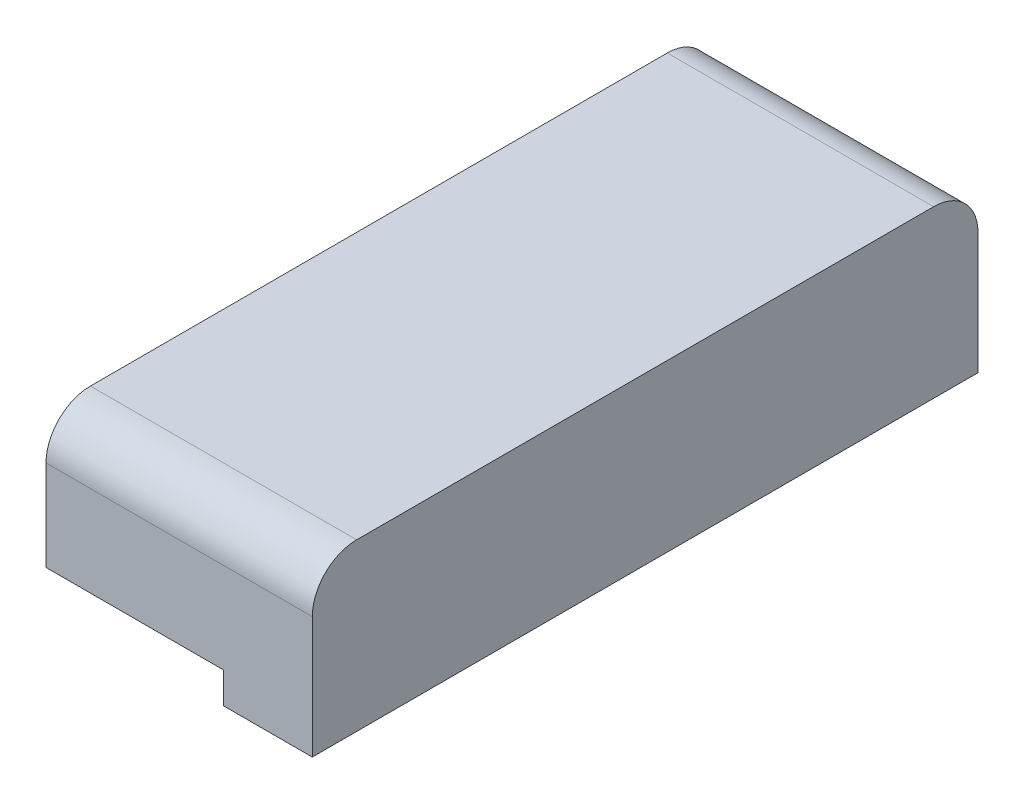
ISO-10303-21;
HEADER;
FILE_DESCRIPTION(('STEP AP214'),'2;1');
FILE_NAME('part.step','',(''),(''),'','','');
FILE_SCHEMA(('AUTOMOTIVE_DESIGN { 1 0 10303 214 1 1 1 1 }'));
ENDSEC;
DATA;
#1=APPLICATION_CONTEXT('core data for automotive mechanical design processes');
#2=APPLICATION_PROTOCOL_DEFINITION('international standard','automotive_design',2000,#1);
#3=PRODUCT_CONTEXT('',#1,'mechanical');
#4=PRODUCT('Part','Part','',(#3));
#5=PRODUCT_RELATED_PRODUCT_CATEGORY('part','',(#4));
#6=PRODUCT_DEFINITION_FORMATION('','',#4);
#7=PRODUCT_DEFINITION_CONTEXT('part definition',#1,'design');
#8=PRODUCT_DEFINITION('design','',#6,#7);
#9=PRODUCT_DEFINITION_SHAPE('','',#8);
#10=(LENGTH_UNIT() NAMED_UNIT(*) SI_UNIT(.MILLI.,.METRE.));
#11=(NAMED_UNIT(*) PLANE_ANGLE_UNIT() SI_UNIT($,.RADIAN.));
#12=(NAMED_UNIT(*) SI_UNIT($,.STERADIAN.) SOLID_ANGLE_UNIT());
#13=UNCERTAINTY_MEASURE_WITH_UNIT(LENGTH_MEASURE(1.E-05),#10,'distance_accuracy_value','');
#14=(GEOMETRIC_REPRESENTATION_CONTEXT(3) GLOBAL_UNCERTAINTY_ASSIGNED_CONTEXT((#13)) GLOBAL_UNIT_ASSIGNED_CONTEXT((#10,
#11,#12)) REPRESENTATION_CONTEXT('',''));
#15=CARTESIAN_POINT('',(0.,0.,0.));
#16=DIRECTION('',(0.,0.,1.));
#17=DIRECTION('',(1.,0.,0.));
#18=AXIS2_PLACEMENT_3D('',#15,#16,#17);
#19=CARTESIAN_POINT('',(3.,0.935000000000001,-3.75));
#20=DIRECTION('',(0.,0.,1.));
#21=DIRECTION('',(0.,-1.,0.));
#22=AXIS2_PLACEMENT_3D('',#19,#20,#21);
#23=PLANE('',#22);
#24=DIRECTION('',(0.,1.,0.));
#25=VECTOR('',#24,1.);
#26=CARTESIAN_POINT('',(0.,0.935000000000001,-3.75));
#27=LINE('',#26,#25);
#28=CARTESIAN_POINT('',(0.,-0.585,-3.75));
#29=VERTEX_POINT('',#28);
#30=CARTESIAN_POINT('',(0.,0.435000000000001,-3.75));
#31=VERTEX_POINT('',#30);
#32=EDGE_CURVE('E159',#29,#31,#27,.T.);
#33=ORIENTED_EDGE('',*,*,#32,.T.);
#34=DIRECTION('',(-1.,0.,0.));
#35=VECTOR('',#34,1.);
#36=CARTESIAN_POINT('',(3.,0.435000000000001,-3.75));
#37=LINE('',#36,#35);
#38=CARTESIAN_POINT('',(3.,0.435000000000001,-3.75));
#39=VERTEX_POINT('',#38);
#40=EDGE_CURVE('E56',#31,#39,#37,.F.);
#41=ORIENTED_EDGE('',*,*,#40,.T.);
#42=DIRECTION('',(0.,1.,0.));
#43=VECTOR('',#42,1.);
#44=CARTESIAN_POINT('',(3.,0.935000000000001,-3.75));
#45=LINE('',#44,#43);
#46=CARTESIAN_POINT('',(3.,-0.935000000000001,-3.75));
#47=VERTEX_POINT('',#46);
#48=EDGE_CURVE('E144',#47,#39,#45,.T.);
#49=ORIENTED_EDGE('',*,*,#48,.F.);
#50=DIRECTION('',(-1.,0.,0.));
#51=VECTOR('',#50,1.);
#52=CARTESIAN_POINT('',(3.,-0.935000000000001,-3.75));
#53=LINE('',#52,#51);
#54=CARTESIAN_POINT('',(2.,-0.935,-3.75));
#55=VERTEX_POINT('',#54);
#56=EDGE_CURVE('E126',#47,#55,#53,.T.);
#57=ORIENTED_EDGE('',*,*,#56,.T.);
#58=DIRECTION('',(0.,-1.,0.));
#59=VECTOR('',#58,1.);
#60=CARTESIAN_POINT('',(2.,-0.935,-3.75));
#61=LINE('',#60,#59);
#62=CARTESIAN_POINT('',(2.,-0.585,-3.75));
#63=VERTEX_POINT('',#62);
#64=EDGE_CURVE('E107',#63,#55,#61,.T.);
#65=ORIENTED_EDGE('',*,*,#64,.F.);
#66=DIRECTION('',(1.,0.,0.));
#67=VECTOR('',#66,1.);
#68=CARTESIAN_POINT('',(0.,-0.585,-3.75));
#69=LINE('',#68,#67);
#70=EDGE_CURVE('E121',#29,#63,#69,.T.);
#71=ORIENTED_EDGE('',*,*,#70,.F.);
#72=EDGE_LOOP('',(#33,#41,#49,#57,#65,#71));
#73=FACE_BOUND('',#72,.T.);
#74=ADVANCED_FACE('F33',(#73),#23,.F.);
#75=CARTESIAN_POINT('',(3.,0.935000000000001,3.75));
#76=DIRECTION('',(0.,-1.,0.));
#77=DIRECTION('',(0.,0.,-1.));
#78=AXIS2_PLACEMENT_3D('',#75,#76,#77);
#79=PLANE('',#78);
#80=DIRECTION('',(0.,0.,1.));
#81=VECTOR('',#80,1.);
#82=CARTESIAN_POINT('',(3.,0.935000000000001,3.75));
#83=LINE('',#82,#81);
#84=CARTESIAN_POINT('',(3.,0.935000000000001,-3.25));
#85=VERTEX_POINT('',#84);
#86=CARTESIAN_POINT('',(3.,0.935000000000001,3.25));
#87=VERTEX_POINT('',#86);
#88=EDGE_CURVE('E143',#85,#87,#83,.T.);
#89=ORIENTED_EDGE('',*,*,#88,.F.);
#90=DIRECTION('',(-1.,0.,0.));
#91=VECTOR('',#90,1.);
#92=CARTESIAN_POINT('',(3.,0.935000000000001,-3.25));
#93=LINE('',#92,#91);
#94=CARTESIAN_POINT('',(0.,0.935000000000001,-3.25));
#95=VERTEX_POINT('',#94);
#96=EDGE_CURVE('E128',#85,#95,#93,.T.);
#97=ORIENTED_EDGE('',*,*,#96,.T.);
#98=DIRECTION('',(0.,0.,1.));
#99=VECTOR('',#98,1.);
#100=CARTESIAN_POINT('',(0.,0.935000000000001,3.75));
#101=LINE('',#100,#99);
#102=CARTESIAN_POINT('',(0.,0.935000000000001,3.25));
#103=VERTEX_POINT('',#102);
#104=EDGE_CURVE('E160',#95,#103,#101,.T.);
#105=ORIENTED_EDGE('',*,*,#104,.T.);
#106=DIRECTION('',(-1.,0.,0.));
#107=VECTOR('',#106,1.);
#108=CARTESIAN_POINT('',(3.,0.935000000000001,3.25));
#109=LINE('',#108,#107);
#110=EDGE_CURVE('E125',#103,#87,#109,.F.);
#111=ORIENTED_EDGE('',*,*,#110,.T.);
#112=EDGE_LOOP('',(#89,#97,#105,#111));
#113=FACE_BOUND('',#112,.T.);
#114=ADVANCED_FACE('F148',(#113),#79,.F.);
#115=CARTESIAN_POINT('',(3.,0.935000000000001,3.75));
#116=DIRECTION('',(0.,0.,-1.));
#117=DIRECTION('',(0.,1.,0.));
#118=AXIS2_PLACEMENT_3D('',#115,#116,#117);
#119=PLANE('',#118);
#120=DIRECTION('',(0.,-1.,0.));
#121=VECTOR('',#120,1.);
#122=CARTESIAN_POINT('',(3.,0.935000000000001,3.75));
#123=LINE('',#122,#121);
#124=CARTESIAN_POINT('',(3.,0.435000000000001,3.75));
#125=VERTEX_POINT('',#124);
#126=CARTESIAN_POINT('',(3.,-0.935,3.75));
#127=VERTEX_POINT('',#126);
#128=EDGE_CURVE('E152',#125,#127,#123,.T.);
#129=ORIENTED_EDGE('',*,*,#128,.F.);
#130=DIRECTION('',(-1.,0.,0.));
#131=VECTOR('',#130,1.);
#132=CARTESIAN_POINT('',(3.,0.435000000000001,3.75));
#133=LINE('',#132,#131);
#134=CARTESIAN_POINT('',(0.,0.435000000000001,3.75));
#135=VERTEX_POINT('',#134);
#136=EDGE_CURVE('E11',#125,#135,#133,.T.);
#137=ORIENTED_EDGE('',*,*,#136,.T.);
#138=DIRECTION('',(0.,-1.,0.));
#139=VECTOR('',#138,1.);
#140=CARTESIAN_POINT('',(0.,0.935000000000001,3.75));
#141=LINE('',#140,#139);
#142=CARTESIAN_POINT('',(0.,-0.585,3.75));
#143=VERTEX_POINT('',#142);
#144=EDGE_CURVE('E165',#135,#143,#141,.T.);
#145=ORIENTED_EDGE('',*,*,#144,.T.);
#146=DIRECTION('',(-1.,0.,0.));
#147=VECTOR('',#146,1.);
#148=CARTESIAN_POINT('',(0.,-0.585,3.75));
#149=LINE('',#148,#147);
#150=CARTESIAN_POINT('',(2.,-0.585,3.75));
#151=VERTEX_POINT('',#150);
#152=EDGE_CURVE('E113',#151,#143,#149,.T.);
#153=ORIENTED_EDGE('',*,*,#152,.F.);
#154=DIRECTION('',(0.,1.,0.));
#155=VECTOR('',#154,1.);
#156=CARTESIAN_POINT('',(2.,-0.935,3.75));
#157=LINE('',#156,#155);
#158=CARTESIAN_POINT('',(2.,-0.935,3.75));
#159=VERTEX_POINT('',#158);
#160=EDGE_CURVE('E104',#159,#151,#157,.T.);
#161=ORIENTED_EDGE('',*,*,#160,.F.);
#162=DIRECTION('',(-1.,0.,0.));
#163=VECTOR('',#162,1.);
#164=CARTESIAN_POINT('',(3.,-0.935,3.75));
#165=LINE('',#164,#163);
#166=EDGE_CURVE('E118',#127,#159,#165,.T.);
#167=ORIENTED_EDGE('',*,*,#166,.F.);
#168=EDGE_LOOP('',(#129,#137,#145,#153,#161,#167));
#169=FACE_BOUND('',#168,.T.);
#170=ADVANCED_FACE('F117',(#169),#119,.F.);
#171=CARTESIAN_POINT('',(3.,-0.935,3.75));
#172=DIRECTION('',(0.,1.,0.));
#173=DIRECTION('',(0.,0.,1.));
#174=AXIS2_PLACEMENT_3D('',#171,#172,#173);
#175=PLANE('',#174);
#176=ORIENTED_EDGE('',*,*,#166,.T.);
#177=DIRECTION('',(0.,0.,1.));
#178=VECTOR('',#177,1.);
#179=CARTESIAN_POINT('',(2.,-0.935,-3.751));
#180=LINE('',#179,#178);
#181=EDGE_CURVE('E101',#55,#159,#180,.T.);
#182=ORIENTED_EDGE('',*,*,#181,.F.);
#183=ORIENTED_EDGE('',*,*,#56,.F.);
#184=DIRECTION('',(0.,0.,-1.));
#185=VECTOR('',#184,1.);
#186=CARTESIAN_POINT('',(3.,-0.935,3.75));
#187=LINE('',#186,#185);
#188=EDGE_CURVE('E124',#127,#47,#187,.T.);
#189=ORIENTED_EDGE('',*,*,#188,.F.);
#190=EDGE_LOOP('',(#176,#182,#183,#189));
#191=FACE_BOUND('',#190,.T.);
#192=ADVANCED_FACE('F123',(#191),#175,.F.);
#193=CARTESIAN_POINT('',(3.,0.,0.));
#194=DIRECTION('',(1.,0.,0.));
#195=DIRECTION('',(0.,0.,-1.));
#196=AXIS2_PLACEMENT_3D('',#193,#194,#195);
#197=PLANE('',#196);
#198=ORIENTED_EDGE('',*,*,#48,.T.);
#199=CARTESIAN_POINT('',(3.,0.435000000000001,-3.25));
#200=DIRECTION('',(1.,0.,0.));
#201=DIRECTION('',(0.,0.,-1.));
#202=AXIS2_PLACEMENT_3D('',#199,#200,#201);
#203=CIRCLE('',#202,0.5);
#204=EDGE_CURVE('E41',#39,#85,#203,.T.);
#205=ORIENTED_EDGE('',*,*,#204,.T.);
#206=ORIENTED_EDGE('',*,*,#88,.T.);
#207=CARTESIAN_POINT('',(3.,0.435000000000001,3.25));
#208=DIRECTION('',(1.,0.,0.));
#209=DIRECTION('',(0.,0.,-1.));
#210=AXIS2_PLACEMENT_3D('',#207,#208,#209);
#211=CIRCLE('',#210,0.5);
#212=EDGE_CURVE('E48',#87,#125,#211,.T.);
#213=ORIENTED_EDGE('',*,*,#212,.T.);
#214=ORIENTED_EDGE('',*,*,#128,.T.);
#215=ORIENTED_EDGE('',*,*,#188,.T.);
#216=EDGE_LOOP('',(#198,#205,#206,#213,#214,#215));
#217=FACE_BOUND('',#216,.T.);
#218=ADVANCED_FACE('F142',(#217),#197,.T.);
#219=CARTESIAN_POINT('',(0.,0.,0.));
#220=DIRECTION('',(1.,0.,0.));
#221=DIRECTION('',(0.,0.,-1.));
#222=AXIS2_PLACEMENT_3D('',#219,#220,#221);
#223=PLANE('',#222);
#224=ORIENTED_EDGE('',*,*,#104,.F.);
#225=CARTESIAN_POINT('',(0.,0.435000000000001,-3.25));
#226=DIRECTION('',(1.,0.,0.));
#227=DIRECTION('',(0.,0.,-1.));
#228=AXIS2_PLACEMENT_3D('',#225,#226,#227);
#229=CIRCLE('',#228,0.5);
#230=EDGE_CURVE('E137',#95,#31,#229,.F.);
#231=ORIENTED_EDGE('',*,*,#230,.T.);
#232=ORIENTED_EDGE('',*,*,#32,.F.);
#233=DIRECTION('',(0.,0.,1.));
#234=VECTOR('',#233,1.);
#235=CARTESIAN_POINT('',(0.,-0.585,-3.751));
#236=LINE('',#235,#234);
#237=EDGE_CURVE('E163',#29,#143,#236,.T.);
#238=ORIENTED_EDGE('',*,*,#237,.T.);
#239=ORIENTED_EDGE('',*,*,#144,.F.);
#240=CARTESIAN_POINT('',(0.,0.435000000000001,3.25));
#241=DIRECTION('',(1.,0.,0.));
#242=DIRECTION('',(0.,0.,-1.));
#243=AXIS2_PLACEMENT_3D('',#240,#241,#242);
#244=CIRCLE('',#243,0.5);
#245=EDGE_CURVE('E135',#135,#103,#244,.F.);
#246=ORIENTED_EDGE('',*,*,#245,.T.);
#247=EDGE_LOOP('',(#224,#231,#232,#238,#239,#246));
#248=FACE_BOUND('',#247,.T.);
#249=ADVANCED_FACE('F157',(#248),#223,.F.);
#250=CARTESIAN_POINT('',(0.,-0.585,-3.751));
#251=DIRECTION('',(0.,1.,0.));
#252=DIRECTION('',(0.,0.,1.));
#253=AXIS2_PLACEMENT_3D('',#250,#251,#252);
#254=PLANE('',#253);
#255=ORIENTED_EDGE('',*,*,#70,.T.);
#256=DIRECTION('',(0.,0.,1.));
#257=VECTOR('',#256,1.);
#258=CARTESIAN_POINT('',(2.,-0.585,-3.751));
#259=LINE('',#258,#257);
#260=EDGE_CURVE('E112',#63,#151,#259,.T.);
#261=ORIENTED_EDGE('',*,*,#260,.T.);
#262=ORIENTED_EDGE('',*,*,#152,.T.);
#263=ORIENTED_EDGE('',*,*,#237,.F.);
#264=EDGE_LOOP('',(#255,#261,#262,#263));
#265=FACE_BOUND('',#264,.T.);
#266=ADVANCED_FACE('F177',(#265),#254,.F.);
#267=CARTESIAN_POINT('',(2.,-0.935,-3.751));
#268=DIRECTION('',(1.,0.,0.));
#269=DIRECTION('',(0.,0.,-1.));
#270=AXIS2_PLACEMENT_3D('',#267,#268,#269);
#271=PLANE('',#270);
#272=ORIENTED_EDGE('',*,*,#64,.T.);
#273=ORIENTED_EDGE('',*,*,#181,.T.);
#274=ORIENTED_EDGE('',*,*,#160,.T.);
#275=ORIENTED_EDGE('',*,*,#260,.F.);
#276=EDGE_LOOP('',(#272,#273,#274,#275));
#277=FACE_BOUND('',#276,.T.);
#278=ADVANCED_FACE('F103',(#277),#271,.F.);
#279=CARTESIAN_POINT('',(3.,0.435000000000001,-3.25));
#280=DIRECTION('',(-1.,0.,0.));
#281=DIRECTION('',(0.,0.,1.));
#282=AXIS2_PLACEMENT_3D('',#279,#280,#281);
#283=CYLINDRICAL_SURFACE('',#282,0.5);
#284=ORIENTED_EDGE('',*,*,#204,.F.);
#285=ORIENTED_EDGE('',*,*,#40,.F.);
#286=ORIENTED_EDGE('',*,*,#230,.F.);
#287=ORIENTED_EDGE('',*,*,#96,.F.);
#288=EDGE_LOOP('',(#284,#285,#286,#287));
#289=FACE_BOUND('',#288,.T.);
#290=ADVANCED_FACE('F154',(#289),#283,.T.);
#291=CARTESIAN_POINT('',(3.,0.435000000000001,3.25));
#292=DIRECTION('',(-1.,0.,0.));
#293=DIRECTION('',(0.,0.,1.));
#294=AXIS2_PLACEMENT_3D('',#291,#292,#293);
#295=CYLINDRICAL_SURFACE('',#294,0.5);
#296=ORIENTED_EDGE('',*,*,#212,.F.);
#297=ORIENTED_EDGE('',*,*,#110,.F.);
#298=ORIENTED_EDGE('',*,*,#245,.F.);
#299=ORIENTED_EDGE('',*,*,#136,.F.);
#300=EDGE_LOOP('',(#296,#297,#298,#299));
#301=FACE_BOUND('',#300,.T.);
#302=ADVANCED_FACE('F35',(#301),#295,.T.);
#303=CLOSED_SHELL('',(#74,#114,#170,#192,#218,#249,#266,#278,#290,#302));
#304=MANIFOLD_SOLID_BREP('B2',#303);
#305=ADVANCED_BREP_SHAPE_REPRESENTATION('',(#18,#304),#14);
#306=SHAPE_DEFINITION_REPRESENTATION(#9,#305);
ENDSEC;
END-ISO-10303-21;
